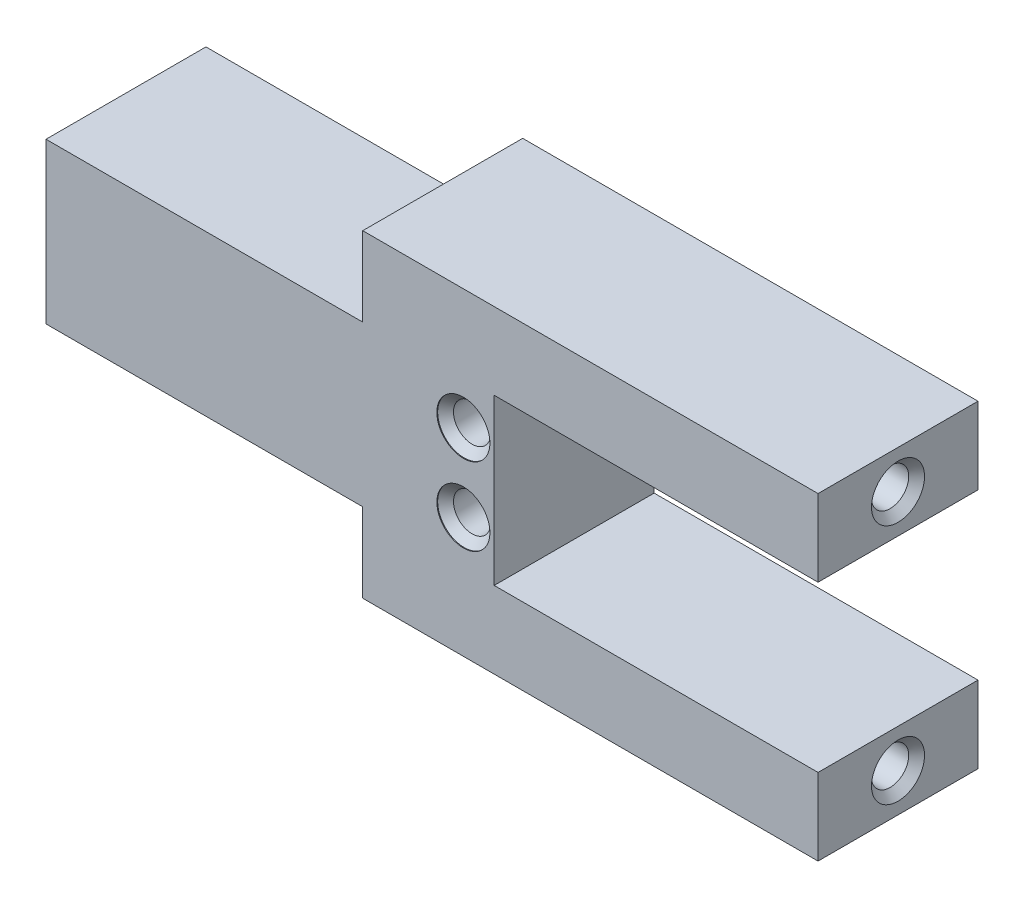
ISO-10303-21;
HEADER;
FILE_DESCRIPTION(('STEP AP214'),'2;1');
FILE_NAME('part.step','',(''),(''),'','','');
FILE_SCHEMA(('AUTOMOTIVE_DESIGN { 1 0 10303 214 1 1 1 1 }'));
ENDSEC;
DATA;
#1=APPLICATION_CONTEXT('core data for automotive mechanical design processes');
#2=APPLICATION_PROTOCOL_DEFINITION('international standard','automotive_design',2000,#1);
#3=PRODUCT_CONTEXT('',#1,'mechanical');
#4=PRODUCT('Part','Part','',(#3));
#5=PRODUCT_RELATED_PRODUCT_CATEGORY('part','',(#4));
#6=PRODUCT_DEFINITION_FORMATION('','',#4);
#7=PRODUCT_DEFINITION_CONTEXT('part definition',#1,'design');
#8=PRODUCT_DEFINITION('design','',#6,#7);
#9=PRODUCT_DEFINITION_SHAPE('','',#8);
#10=(LENGTH_UNIT() NAMED_UNIT(*) SI_UNIT(.MILLI.,.METRE.));
#11=(NAMED_UNIT(*) PLANE_ANGLE_UNIT() SI_UNIT($,.RADIAN.));
#12=(NAMED_UNIT(*) SI_UNIT($,.STERADIAN.) SOLID_ANGLE_UNIT());
#13=UNCERTAINTY_MEASURE_WITH_UNIT(LENGTH_MEASURE(1.E-05),#10,'distance_accuracy_value','');
#14=(GEOMETRIC_REPRESENTATION_CONTEXT(3) GLOBAL_UNCERTAINTY_ASSIGNED_CONTEXT((#13)) GLOBAL_UNIT_ASSIGNED_CONTEXT((#10,
#11,#12)) REPRESENTATION_CONTEXT('',''));
#15=CARTESIAN_POINT('',(0.,0.,0.));
#16=DIRECTION('',(0.,0.,1.));
#17=DIRECTION('',(1.,0.,0.));
#18=AXIS2_PLACEMENT_3D('',#15,#16,#17);
#19=CARTESIAN_POINT('',(84.7,20.1,10.));
#20=DIRECTION('',(0.,-1.,0.));
#21=DIRECTION('',(0.,0.,-1.));
#22=AXIS2_PLACEMENT_3D('',#19,#20,#21);
#23=PLANE('',#22);
#24=DIRECTION('',(0.,0.,-1.));
#25=VECTOR('',#24,1.);
#26=CARTESIAN_POINT('',(15.3,20.1,10.));
#27=LINE('',#26,#25);
#28=CARTESIAN_POINT('',(15.3,20.1,10.1));
#29=VERTEX_POINT('',#28);
#30=CARTESIAN_POINT('',(15.3,20.1,-10.1));
#31=VERTEX_POINT('',#30);
#32=EDGE_CURVE('E260',#29,#31,#27,.T.);
#33=ORIENTED_EDGE('',*,*,#32,.F.);
#34=DIRECTION('',(-1.,0.,0.));
#35=VECTOR('',#34,1.);
#36=CARTESIAN_POINT('',(72.8,20.1,10.1));
#37=LINE('',#36,#35);
#38=CARTESIAN_POINT('',(72.8,20.1,10.1));
#39=VERTEX_POINT('',#38);
#40=EDGE_CURVE('E203',#39,#29,#37,.T.);
#41=ORIENTED_EDGE('',*,*,#40,.F.);
#42=DIRECTION('',(0.,0.,1.));
#43=VECTOR('',#42,1.);
#44=CARTESIAN_POINT('',(72.8,20.1,-10.));
#45=LINE('',#44,#43);
#46=CARTESIAN_POINT('',(72.8,20.1,-10.1));
#47=VERTEX_POINT('',#46);
#48=EDGE_CURVE('E150',#47,#39,#45,.T.);
#49=ORIENTED_EDGE('',*,*,#48,.F.);
#50=DIRECTION('',(1.,0.,0.));
#51=VECTOR('',#50,1.);
#52=CARTESIAN_POINT('',(15.3,20.1,-10.1));
#53=LINE('',#52,#51);
#54=EDGE_CURVE('E174',#31,#47,#53,.T.);
#55=ORIENTED_EDGE('',*,*,#54,.F.);
#56=EDGE_LOOP('',(#33,#41,#49,#55));
#57=FACE_BOUND('',#56,.T.);
#58=ADVANCED_FACE('F41',(#57),#23,.F.);
#59=CARTESIAN_POINT('',(84.7,-20.1,10.));
#60=DIRECTION('',(0.,1.,0.));
#61=DIRECTION('',(0.,0.,1.));
#62=AXIS2_PLACEMENT_3D('',#59,#60,#61);
#63=PLANE('',#62);
#64=DIRECTION('',(0.,0.,1.));
#65=VECTOR('',#64,1.);
#66=CARTESIAN_POINT('',(15.3,-20.1,10.));
#67=LINE('',#66,#65);
#68=CARTESIAN_POINT('',(15.3,-20.1,-10.1));
#69=VERTEX_POINT('',#68);
#70=CARTESIAN_POINT('',(15.3,-20.1,10.1));
#71=VERTEX_POINT('',#70);
#72=EDGE_CURVE('E155',#69,#71,#67,.T.);
#73=ORIENTED_EDGE('',*,*,#72,.F.);
#74=DIRECTION('',(-1.,0.,0.));
#75=VECTOR('',#74,1.);
#76=CARTESIAN_POINT('',(72.8,-20.1,-10.1));
#77=LINE('',#76,#75);
#78=CARTESIAN_POINT('',(72.8,-20.1,-10.1));
#79=VERTEX_POINT('',#78);
#80=EDGE_CURVE('E153',#79,#69,#77,.T.);
#81=ORIENTED_EDGE('',*,*,#80,.F.);
#82=DIRECTION('',(0.,0.,1.));
#83=VECTOR('',#82,1.);
#84=CARTESIAN_POINT('',(72.8,-20.1,-10.));
#85=LINE('',#84,#83);
#86=CARTESIAN_POINT('',(72.8,-20.1,10.1));
#87=VERTEX_POINT('',#86);
#88=EDGE_CURVE('E138',#79,#87,#85,.T.);
#89=ORIENTED_EDGE('',*,*,#88,.T.);
#90=DIRECTION('',(1.,0.,0.));
#91=VECTOR('',#90,1.);
#92=CARTESIAN_POINT('',(15.3,-20.1,10.1));
#93=LINE('',#92,#91);
#94=EDGE_CURVE('E211',#71,#87,#93,.T.);
#95=ORIENTED_EDGE('',*,*,#94,.F.);
#96=EDGE_LOOP('',(#73,#81,#89,#95));
#97=FACE_BOUND('',#96,.T.);
#98=ADVANCED_FACE('F154',(#97),#63,.F.);
#99=CARTESIAN_POINT('',(31.9,10.4,-10.));
#100=DIRECTION('',(-1.,0.,0.));
#101=DIRECTION('',(0.,0.,1.));
#102=AXIS2_PLACEMENT_3D('',#99,#100,#101);
#103=PLANE('',#102);
#104=DIRECTION('',(0.,0.,1.));
#105=VECTOR('',#104,1.);
#106=CARTESIAN_POINT('',(31.9,10.4,-10.));
#107=LINE('',#106,#105);
#108=CARTESIAN_POINT('',(31.9,10.4,-10.1));
#109=VERTEX_POINT('',#108);
#110=CARTESIAN_POINT('',(31.9,10.4,10.1));
#111=VERTEX_POINT('',#110);
#112=EDGE_CURVE('E281',#109,#111,#107,.T.);
#113=ORIENTED_EDGE('',*,*,#112,.T.);
#114=DIRECTION('',(0.,1.,0.));
#115=VECTOR('',#114,1.);
#116=CARTESIAN_POINT('',(31.9,-10.4,10.1));
#117=LINE('',#116,#115);
#118=CARTESIAN_POINT('',(31.9,-10.4,10.1));
#119=VERTEX_POINT('',#118);
#120=EDGE_CURVE('E220',#119,#111,#117,.T.);
#121=ORIENTED_EDGE('',*,*,#120,.F.);
#122=DIRECTION('',(0.,0.,1.));
#123=VECTOR('',#122,1.);
#124=CARTESIAN_POINT('',(31.9,-10.4,-10.));
#125=LINE('',#124,#123);
#126=CARTESIAN_POINT('',(31.9,-10.4,-10.1));
#127=VERTEX_POINT('',#126);
#128=EDGE_CURVE('E149',#127,#119,#125,.T.);
#129=ORIENTED_EDGE('',*,*,#128,.F.);
#130=DIRECTION('',(0.,-1.,0.));
#131=VECTOR('',#130,1.);
#132=CARTESIAN_POINT('',(31.9,10.4,-10.1));
#133=LINE('',#132,#131);
#134=EDGE_CURVE('E186',#109,#127,#133,.T.);
#135=ORIENTED_EDGE('',*,*,#134,.F.);
#136=EDGE_LOOP('',(#113,#121,#129,#135));
#137=FACE_BOUND('',#136,.T.);
#138=ADVANCED_FACE('F372',(#137),#103,.F.);
#139=CARTESIAN_POINT('',(72.8,10.4,-10.));
#140=DIRECTION('',(0.,1.,0.));
#141=DIRECTION('',(-1.,0.,0.));
#142=AXIS2_PLACEMENT_3D('',#139,#140,#141);
#143=PLANE('',#142);
#144=DIRECTION('',(0.,0.,1.));
#145=VECTOR('',#144,1.);
#146=CARTESIAN_POINT('',(72.8,10.4,-10.));
#147=LINE('',#146,#145);
#148=CARTESIAN_POINT('',(72.8,10.4,-10.1));
#149=VERTEX_POINT('',#148);
#150=CARTESIAN_POINT('',(72.8,10.4,10.1));
#151=VERTEX_POINT('',#150);
#152=EDGE_CURVE('E88',#149,#151,#147,.T.);
#153=ORIENTED_EDGE('',*,*,#152,.T.);
#154=DIRECTION('',(1.,0.,0.));
#155=VECTOR('',#154,1.);
#156=CARTESIAN_POINT('',(31.9,10.4,10.1));
#157=LINE('',#156,#155);
#158=EDGE_CURVE('E224',#111,#151,#157,.T.);
#159=ORIENTED_EDGE('',*,*,#158,.F.);
#160=ORIENTED_EDGE('',*,*,#112,.F.);
#161=DIRECTION('',(-1.,0.,0.));
#162=VECTOR('',#161,1.);
#163=CARTESIAN_POINT('',(72.8,10.4,-10.1));
#164=LINE('',#163,#162);
#165=EDGE_CURVE('E182',#149,#109,#164,.T.);
#166=ORIENTED_EDGE('',*,*,#165,.F.);
#167=EDGE_LOOP('',(#153,#159,#160,#166));
#168=FACE_BOUND('',#167,.T.);
#169=ADVANCED_FACE('F524',(#168),#143,.F.);
#170=CARTESIAN_POINT('',(72.8,-10.4,-10.));
#171=DIRECTION('',(0.,-1.,0.));
#172=DIRECTION('',(1.,0.,0.));
#173=AXIS2_PLACEMENT_3D('',#170,#171,#172);
#174=PLANE('',#173);
#175=ORIENTED_EDGE('',*,*,#128,.T.);
#176=DIRECTION('',(-1.,0.,0.));
#177=VECTOR('',#176,1.);
#178=CARTESIAN_POINT('',(72.8,-10.4,10.1));
#179=LINE('',#178,#177);
#180=CARTESIAN_POINT('',(72.8,-10.4,10.1));
#181=VERTEX_POINT('',#180);
#182=EDGE_CURVE('E216',#181,#119,#179,.T.);
#183=ORIENTED_EDGE('',*,*,#182,.F.);
#184=DIRECTION('',(0.,0.,1.));
#185=VECTOR('',#184,1.);
#186=CARTESIAN_POINT('',(72.8,-10.4,-10.));
#187=LINE('',#186,#185);
#188=CARTESIAN_POINT('',(72.8,-10.4,-10.1));
#189=VERTEX_POINT('',#188);
#190=EDGE_CURVE('E287',#189,#181,#187,.T.);
#191=ORIENTED_EDGE('',*,*,#190,.F.);
#192=DIRECTION('',(1.,0.,0.));
#193=VECTOR('',#192,1.);
#194=CARTESIAN_POINT('',(31.9,-10.4,-10.1));
#195=LINE('',#194,#193);
#196=EDGE_CURVE('E167',#127,#189,#195,.T.);
#197=ORIENTED_EDGE('',*,*,#196,.F.);
#198=EDGE_LOOP('',(#175,#183,#191,#197));
#199=FACE_BOUND('',#198,.T.);
#200=ADVANCED_FACE('F363',(#199),#174,.F.);
#201=CARTESIAN_POINT('',(72.8,20.1,-10.));
#202=DIRECTION('',(-1.,0.,0.));
#203=DIRECTION('',(0.,0.,1.));
#204=AXIS2_PLACEMENT_3D('',#201,#202,#203);
#205=PLANE('',#204);
#206=CARTESIAN_POINT('',(72.8,-15.25,0.));
#207=DIRECTION('',(-1.,0.,0.));
#208=DIRECTION('',(0.,0.,1.));
#209=AXIS2_PLACEMENT_3D('',#206,#207,#208);
#210=CIRCLE('',#209,3.35000000000001);
#211=CARTESIAN_POINT('',(72.8,-15.25,3.35));
#212=VERTEX_POINT('',#211);
#213=EDGE_CURVE('E319',#212,#212,#210,.T.);
#214=ORIENTED_EDGE('',*,*,#213,.T.);
#215=EDGE_LOOP('',(#214));
#216=FACE_BOUND('',#215,.T.);
#217=ORIENTED_EDGE('',*,*,#190,.T.);
#218=DIRECTION('',(0.,1.,0.));
#219=VECTOR('',#218,1.);
#220=CARTESIAN_POINT('',(72.8,-20.1,10.1));
#221=LINE('',#220,#219);
#222=EDGE_CURVE('E144',#87,#181,#221,.T.);
#223=ORIENTED_EDGE('',*,*,#222,.F.);
#224=ORIENTED_EDGE('',*,*,#88,.F.);
#225=DIRECTION('',(0.,-1.,0.));
#226=VECTOR('',#225,1.);
#227=CARTESIAN_POINT('',(72.8,-10.4,-10.1));
#228=LINE('',#227,#226);
#229=EDGE_CURVE('E142',#189,#79,#228,.T.);
#230=ORIENTED_EDGE('',*,*,#229,.F.);
#231=EDGE_LOOP('',(#217,#223,#224,#230));
#232=FACE_BOUND('',#231,.T.);
#233=ADVANCED_FACE('F140',(#216,#232),#205,.F.);
#234=CARTESIAN_POINT('',(72.8,15.25,0.));
#235=DIRECTION('',(-1.,0.,0.));
#236=DIRECTION('',(0.,0.,1.));
#237=AXIS2_PLACEMENT_3D('',#234,#235,#236);
#238=CIRCLE('',#237,3.35000000000001);
#239=CARTESIAN_POINT('',(72.8,15.25,3.35000000000001));
#240=VERTEX_POINT('',#239);
#241=EDGE_CURVE('E311',#240,#240,#238,.T.);
#242=ORIENTED_EDGE('',*,*,#241,.T.);
#243=EDGE_LOOP('',(#242));
#244=FACE_BOUND('',#243,.T.);
#245=ORIENTED_EDGE('',*,*,#152,.F.);
#246=DIRECTION('',(0.,-1.,0.));
#247=VECTOR('',#246,1.);
#248=CARTESIAN_POINT('',(72.8,20.1,-10.1));
#249=LINE('',#248,#247);
#250=EDGE_CURVE('E178',#47,#149,#249,.T.);
#251=ORIENTED_EDGE('',*,*,#250,.F.);
#252=ORIENTED_EDGE('',*,*,#48,.T.);
#253=DIRECTION('',(0.,1.,0.));
#254=VECTOR('',#253,1.);
#255=CARTESIAN_POINT('',(72.8,10.4,10.1));
#256=LINE('',#255,#254);
#257=EDGE_CURVE('E199',#151,#39,#256,.T.);
#258=ORIENTED_EDGE('',*,*,#257,.F.);
#259=EDGE_LOOP('',(#245,#251,#252,#258));
#260=FACE_BOUND('',#259,.T.);
#261=ADVANCED_FACE('F351',(#244,#260),#205,.F.);
#262=CARTESIAN_POINT('',(62.8,15.25,0.));
#263=DIRECTION('',(1.,0.,0.));
#264=DIRECTION('',(0.,0.,-1.));
#265=AXIS2_PLACEMENT_3D('',#262,#263,#264);
#266=CYLINDRICAL_SURFACE('',#265,2.35);
#267=CARTESIAN_POINT('',(71.8,15.25,0.));
#268=DIRECTION('',(-1.,0.,0.));
#269=DIRECTION('',(0.,0.,1.));
#270=AXIS2_PLACEMENT_3D('',#267,#268,#269);
#271=CIRCLE('',#270,2.35);
#272=CARTESIAN_POINT('',(71.8,15.25,2.35));
#273=VERTEX_POINT('',#272);
#274=EDGE_CURVE('E307',#273,#273,#271,.F.);
#275=ORIENTED_EDGE('',*,*,#274,.T.);
#276=EDGE_LOOP('',(#275));
#277=FACE_BOUND('',#276,.T.);
#278=CARTESIAN_POINT('',(62.8,15.25,0.));
#279=DIRECTION('',(1.,0.,0.));
#280=DIRECTION('',(0.,0.,1.));
#281=AXIS2_PLACEMENT_3D('',#278,#279,#280);
#282=CIRCLE('',#281,2.35);
#283=CARTESIAN_POINT('',(62.8,15.25,2.35));
#284=VERTEX_POINT('',#283);
#285=EDGE_CURVE('E263',#284,#284,#282,.T.);
#286=ORIENTED_EDGE('',*,*,#285,.F.);
#287=EDGE_LOOP('',(#286));
#288=FACE_BOUND('',#287,.T.);
#289=ADVANCED_FACE('F353',(#277,#288),#266,.F.);
#290=CARTESIAN_POINT('',(62.8,15.25,0.));
#291=DIRECTION('',(-1.,0.,0.));
#292=DIRECTION('',(0.,0.,1.));
#293=AXIS2_PLACEMENT_3D('',#290,#291,#292);
#294=PLANE('',#293);
#295=ORIENTED_EDGE('',*,*,#285,.T.);
#296=EDGE_LOOP('',(#295));
#297=FACE_BOUND('',#296,.T.);
#298=ADVANCED_FACE('F360',(#297),#294,.F.);
#299=CARTESIAN_POINT('',(62.8,-15.25,0.));
#300=DIRECTION('',(1.,0.,0.));
#301=DIRECTION('',(0.,0.,-1.));
#302=AXIS2_PLACEMENT_3D('',#299,#300,#301);
#303=CYLINDRICAL_SURFACE('',#302,2.35);
#304=CARTESIAN_POINT('',(71.8,-15.25,0.));
#305=DIRECTION('',(-1.,0.,0.));
#306=DIRECTION('',(0.,0.,1.));
#307=AXIS2_PLACEMENT_3D('',#304,#305,#306);
#308=CIRCLE('',#307,2.35);
#309=CARTESIAN_POINT('',(71.8,-15.25,2.35));
#310=VERTEX_POINT('',#309);
#311=EDGE_CURVE('E315',#310,#310,#308,.F.);
#312=ORIENTED_EDGE('',*,*,#311,.T.);
#313=EDGE_LOOP('',(#312));
#314=FACE_BOUND('',#313,.T.);
#315=CARTESIAN_POINT('',(62.8,-15.25,0.));
#316=DIRECTION('',(1.,0.,0.));
#317=DIRECTION('',(0.,0.,-1.));
#318=AXIS2_PLACEMENT_3D('',#315,#316,#317);
#319=CIRCLE('',#318,2.35);
#320=CARTESIAN_POINT('',(62.8,-15.25,-2.35));
#321=VERTEX_POINT('',#320);
#322=EDGE_CURVE('E264',#321,#321,#319,.T.);
#323=ORIENTED_EDGE('',*,*,#322,.F.);
#324=EDGE_LOOP('',(#323));
#325=FACE_BOUND('',#324,.T.);
#326=ADVANCED_FACE('F414',(#314,#325),#303,.F.);
#327=CARTESIAN_POINT('',(62.8,-15.25,0.));
#328=DIRECTION('',(1.,0.,0.));
#329=DIRECTION('',(0.,0.,-1.));
#330=AXIS2_PLACEMENT_3D('',#327,#328,#329);
#331=PLANE('',#330);
#332=ORIENTED_EDGE('',*,*,#322,.T.);
#333=EDGE_LOOP('',(#332));
#334=FACE_BOUND('',#333,.T.);
#335=ADVANCED_FACE('F400',(#334),#331,.T.);
#336=CARTESIAN_POINT('',(71.8,15.25,0.));
#337=DIRECTION('',(1.,0.,0.));
#338=DIRECTION('',(0.,0.,-1.));
#339=AXIS2_PLACEMENT_3D('',#336,#337,#338);
#340=CONICAL_SURFACE('',#339,2.35,0.785398163397444);
#341=ORIENTED_EDGE('',*,*,#241,.F.);
#342=EDGE_LOOP('',(#341));
#343=FACE_BOUND('',#342,.T.);
#344=ORIENTED_EDGE('',*,*,#274,.F.);
#345=EDGE_LOOP('',(#344));
#346=FACE_BOUND('',#345,.T.);
#347=ADVANCED_FACE('F394',(#343,#346),#340,.F.);
#348=CARTESIAN_POINT('',(71.8,-15.25,0.));
#349=DIRECTION('',(1.,0.,0.));
#350=DIRECTION('',(0.,0.,-1.));
#351=AXIS2_PLACEMENT_3D('',#348,#349,#350);
#352=CONICAL_SURFACE('',#351,2.35,0.785398163397444);
#353=ORIENTED_EDGE('',*,*,#213,.F.);
#354=EDGE_LOOP('',(#353));
#355=FACE_BOUND('',#354,.T.);
#356=ORIENTED_EDGE('',*,*,#311,.F.);
#357=EDGE_LOOP('',(#356));
#358=FACE_BOUND('',#357,.T.);
#359=ADVANCED_FACE('F399',(#355,#358),#352,.F.);
#360=CARTESIAN_POINT('',(15.3,0.,0.));
#361=DIRECTION('',(1.,0.,0.));
#362=DIRECTION('',(0.,0.,-1.));
#363=AXIS2_PLACEMENT_3D('',#360,#361,#362);
#364=PLANE('',#363);
#365=ORIENTED_EDGE('',*,*,#32,.T.);
#366=DIRECTION('',(0.,1.,0.));
#367=VECTOR('',#366,1.);
#368=CARTESIAN_POINT('',(15.3,-20.1,-10.1));
#369=LINE('',#368,#367);
#370=CARTESIAN_POINT('',(15.3,10.1,-10.1));
#371=VERTEX_POINT('',#370);
#372=EDGE_CURVE('E160',#371,#31,#369,.T.);
#373=ORIENTED_EDGE('',*,*,#372,.F.);
#374=DIRECTION('',(0.,0.,1.));
#375=VECTOR('',#374,1.);
#376=CARTESIAN_POINT('',(15.3,10.1,0.));
#377=LINE('',#376,#375);
#378=CARTESIAN_POINT('',(15.3,10.1,10.1));
#379=VERTEX_POINT('',#378);
#380=EDGE_CURVE('E11',#371,#379,#377,.T.);
#381=ORIENTED_EDGE('',*,*,#380,.T.);
#382=DIRECTION('',(0.,-1.,0.));
#383=VECTOR('',#382,1.);
#384=CARTESIAN_POINT('',(15.3,20.1,10.1));
#385=LINE('',#384,#383);
#386=EDGE_CURVE('E208',#29,#379,#385,.T.);
#387=ORIENTED_EDGE('',*,*,#386,.F.);
#388=EDGE_LOOP('',(#365,#373,#381,#387));
#389=FACE_BOUND('',#388,.T.);
#390=ADVANCED_FACE('F340',(#389),#364,.F.);
#391=CARTESIAN_POINT('',(15.3,0.,0.));
#392=DIRECTION('',(1.,0.,0.));
#393=DIRECTION('',(0.,0.,-1.));
#394=AXIS2_PLACEMENT_3D('',#391,#392,#393);
#395=PLANE('',#394);
#396=ORIENTED_EDGE('',*,*,#72,.T.);
#397=CARTESIAN_POINT('',(15.3,-10.1,10.1));
#398=VERTEX_POINT('',#397);
#399=EDGE_CURVE('E207',#398,#71,#385,.T.);
#400=ORIENTED_EDGE('',*,*,#399,.F.);
#401=DIRECTION('',(0.,0.,-1.));
#402=VECTOR('',#401,1.);
#403=CARTESIAN_POINT('',(15.3,-10.1,0.));
#404=LINE('',#403,#402);
#405=CARTESIAN_POINT('',(15.3,-10.1,-10.1));
#406=VERTEX_POINT('',#405);
#407=EDGE_CURVE('E51',#398,#406,#404,.T.);
#408=ORIENTED_EDGE('',*,*,#407,.T.);
#409=EDGE_CURVE('E171',#69,#406,#369,.T.);
#410=ORIENTED_EDGE('',*,*,#409,.F.);
#411=EDGE_LOOP('',(#396,#400,#408,#410));
#412=FACE_BOUND('',#411,.T.);
#413=ADVANCED_FACE('F328',(#412),#395,.F.);
#414=CARTESIAN_POINT('',(43.8671139599365,-10.1,-10.1));
#415=DIRECTION('',(0.,-1.,0.));
#416=DIRECTION('',(0.,0.,-1.));
#417=AXIS2_PLACEMENT_3D('',#414,#415,#416);
#418=PLANE('',#417);
#419=DIRECTION('',(-1.,0.,0.));
#420=VECTOR('',#419,1.);
#421=CARTESIAN_POINT('',(43.8671139599365,-10.1,-10.1));
#422=LINE('',#421,#420);
#423=CARTESIAN_POINT('',(-24.7,-10.1,-10.1));
#424=VERTEX_POINT('',#423);
#425=EDGE_CURVE('E245',#406,#424,#422,.T.);
#426=ORIENTED_EDGE('',*,*,#425,.F.);
#427=ORIENTED_EDGE('',*,*,#407,.F.);
#428=DIRECTION('',(-1.,0.,0.));
#429=VECTOR('',#428,1.);
#430=CARTESIAN_POINT('',(43.8671139599365,-10.1,10.1));
#431=LINE('',#430,#429);
#432=CARTESIAN_POINT('',(-24.7,-10.1,10.1));
#433=VERTEX_POINT('',#432);
#434=EDGE_CURVE('E76',#398,#433,#431,.T.);
#435=ORIENTED_EDGE('',*,*,#434,.T.);
#436=DIRECTION('',(0.,0.,1.));
#437=VECTOR('',#436,1.);
#438=CARTESIAN_POINT('',(-24.7,-10.1,-10.1));
#439=LINE('',#438,#437);
#440=EDGE_CURVE('E240',#424,#433,#439,.T.);
#441=ORIENTED_EDGE('',*,*,#440,.F.);
#442=EDGE_LOOP('',(#426,#427,#435,#441));
#443=FACE_BOUND('',#442,.T.);
#444=ADVANCED_FACE('F331',(#443),#418,.T.);
#445=CARTESIAN_POINT('',(43.8671139599365,10.1,-10.1));
#446=DIRECTION('',(0.,0.,-1.));
#447=DIRECTION('',(0.,1.,0.));
#448=AXIS2_PLACEMENT_3D('',#445,#446,#447);
#449=PLANE('',#448);
#450=DIRECTION('',(-1.,0.,0.));
#451=VECTOR('',#450,1.);
#452=CARTESIAN_POINT('',(43.8671139599365,10.1,-10.1));
#453=LINE('',#452,#451);
#454=CARTESIAN_POINT('',(-24.7,10.1,-10.1));
#455=VERTEX_POINT('',#454);
#456=EDGE_CURVE('E248',#371,#455,#453,.T.);
#457=ORIENTED_EDGE('',*,*,#456,.F.);
#458=ORIENTED_EDGE('',*,*,#372,.T.);
#459=ORIENTED_EDGE('',*,*,#54,.T.);
#460=ORIENTED_EDGE('',*,*,#250,.T.);
#461=ORIENTED_EDGE('',*,*,#165,.T.);
#462=ORIENTED_EDGE('',*,*,#134,.T.);
#463=ORIENTED_EDGE('',*,*,#196,.T.);
#464=ORIENTED_EDGE('',*,*,#229,.T.);
#465=ORIENTED_EDGE('',*,*,#80,.T.);
#466=ORIENTED_EDGE('',*,*,#409,.T.);
#467=ORIENTED_EDGE('',*,*,#425,.T.);
#468=DIRECTION('',(0.,-1.,0.));
#469=VECTOR('',#468,1.);
#470=CARTESIAN_POINT('',(-24.7,10.1,-10.1));
#471=LINE('',#470,#469);
#472=EDGE_CURVE('E227',#455,#424,#471,.T.);
#473=ORIENTED_EDGE('',*,*,#472,.F.);
#474=EDGE_LOOP('',(#457,#458,#459,#460,#461,#462,#463,#464,#465,#466,#467,#473));
#475=FACE_BOUND('',#474,.T.);
#476=ADVANCED_FACE('F164',(#475),#449,.T.);
#477=CARTESIAN_POINT('',(43.8671139599365,10.1,10.1));
#478=DIRECTION('',(0.,1.,0.));
#479=DIRECTION('',(0.,0.,1.));
#480=AXIS2_PLACEMENT_3D('',#477,#478,#479);
#481=PLANE('',#480);
#482=DIRECTION('',(-1.,0.,0.));
#483=VECTOR('',#482,1.);
#484=CARTESIAN_POINT('',(43.8671139599365,10.1,10.1));
#485=LINE('',#484,#483);
#486=CARTESIAN_POINT('',(-24.7,10.1,10.1));
#487=VERTEX_POINT('',#486);
#488=EDGE_CURVE('E244',#379,#487,#485,.T.);
#489=ORIENTED_EDGE('',*,*,#488,.F.);
#490=ORIENTED_EDGE('',*,*,#380,.F.);
#491=ORIENTED_EDGE('',*,*,#456,.T.);
#492=DIRECTION('',(0.,0.,-1.));
#493=VECTOR('',#492,1.);
#494=CARTESIAN_POINT('',(-24.7,10.1,10.1));
#495=LINE('',#494,#493);
#496=EDGE_CURVE('E232',#487,#455,#495,.T.);
#497=ORIENTED_EDGE('',*,*,#496,.F.);
#498=EDGE_LOOP('',(#489,#490,#491,#497));
#499=FACE_BOUND('',#498,.T.);
#500=ADVANCED_FACE('F339',(#499),#481,.T.);
#501=CARTESIAN_POINT('',(43.8671139599365,-10.1,10.1));
#502=DIRECTION('',(0.,0.,1.));
#503=DIRECTION('',(0.,-1.,0.));
#504=AXIS2_PLACEMENT_3D('',#501,#502,#503);
#505=PLANE('',#504);
#506=ORIENTED_EDGE('',*,*,#434,.F.);
#507=ORIENTED_EDGE('',*,*,#399,.T.);
#508=ORIENTED_EDGE('',*,*,#94,.T.);
#509=ORIENTED_EDGE('',*,*,#222,.T.);
#510=ORIENTED_EDGE('',*,*,#182,.T.);
#511=ORIENTED_EDGE('',*,*,#120,.T.);
#512=ORIENTED_EDGE('',*,*,#158,.T.);
#513=ORIENTED_EDGE('',*,*,#257,.T.);
#514=ORIENTED_EDGE('',*,*,#40,.T.);
#515=ORIENTED_EDGE('',*,*,#386,.T.);
#516=ORIENTED_EDGE('',*,*,#488,.T.);
#517=DIRECTION('',(0.,1.,0.));
#518=VECTOR('',#517,1.);
#519=CARTESIAN_POINT('',(-24.7,-10.1,10.1));
#520=LINE('',#519,#518);
#521=EDGE_CURVE('E236',#433,#487,#520,.T.);
#522=ORIENTED_EDGE('',*,*,#521,.F.);
#523=EDGE_LOOP('',(#506,#507,#508,#509,#510,#511,#512,#513,#514,#515,#516,#522));
#524=FACE_BOUND('',#523,.T.);
#525=CARTESIAN_POINT('',(28.01,-4.9,10.1));
#526=DIRECTION('',(0.,0.,1.));
#527=DIRECTION('',(1.,0.,0.));
#528=AXIS2_PLACEMENT_3D('',#525,#526,#527);
#529=CIRCLE('',#528,3.34999999999999);
#530=CARTESIAN_POINT('',(31.36,-4.9,10.1));
#531=VERTEX_POINT('',#530);
#532=EDGE_CURVE('E195',#531,#531,#529,.T.);
#533=ORIENTED_EDGE('',*,*,#532,.F.);
#534=EDGE_LOOP('',(#533));
#535=FACE_BOUND('',#534,.T.);
#536=CARTESIAN_POINT('',(28.01,4.9,10.1));
#537=DIRECTION('',(0.,0.,1.));
#538=DIRECTION('',(1.,0.,0.));
#539=AXIS2_PLACEMENT_3D('',#536,#537,#538);
#540=CIRCLE('',#539,3.34999999999999);
#541=CARTESIAN_POINT('',(31.36,4.9,10.1));
#542=VERTEX_POINT('',#541);
#543=EDGE_CURVE('E191',#542,#542,#540,.T.);
#544=ORIENTED_EDGE('',*,*,#543,.F.);
#545=EDGE_LOOP('',(#544));
#546=FACE_BOUND('',#545,.T.);
#547=ADVANCED_FACE('F344',(#524,#535,#546),#505,.T.);
#548=CARTESIAN_POINT('',(-22.7,0.,0.));
#549=DIRECTION('',(-1.,0.,0.));
#550=DIRECTION('',(0.,0.,1.));
#551=AXIS2_PLACEMENT_3D('',#548,#549,#550);
#552=PLANE('',#551);
#553=CARTESIAN_POINT('',(-22.7,0.,0.));
#554=DIRECTION('',(-1.,0.,0.));
#555=DIRECTION('',(0.,0.,1.));
#556=AXIS2_PLACEMENT_3D('',#553,#554,#555);
#557=CIRCLE('',#556,0.0133630953863843);
#558=CARTESIAN_POINT('',(-22.7,0.,0.0133630953863843));
#559=VERTEX_POINT('',#558);
#560=EDGE_CURVE('E323',#559,#559,#557,.T.);
#561=ORIENTED_EDGE('',*,*,#560,.T.);
#562=EDGE_LOOP('',(#561));
#563=FACE_BOUND('',#562,.T.);
#564=ADVANCED_FACE('F577',(#563),#552,.T.);
#565=CARTESIAN_POINT('',(-25.93,0.,0.));
#566=DIRECTION('',(1.,0.,0.));
#567=DIRECTION('',(0.,0.,-1.));
#568=AXIS2_PLACEMENT_3D('',#565,#566,#567);
#569=DEGENERATE_TOROIDAL_SURFACE('',#568,0.0133630953863843,3.23,.T.);
#570=CARTESIAN_POINT('',(-24.7,0.,0.));
#571=DIRECTION('',(-1.,0.,0.));
#572=DIRECTION('',(0.,0.,1.));
#573=AXIS2_PLACEMENT_3D('',#570,#571,#572);
#574=CIRCLE('',#573,3.);
#575=CARTESIAN_POINT('',(-24.7,0.,3.));
#576=VERTEX_POINT('',#575);
#577=EDGE_CURVE('E231',#576,#576,#574,.T.);
#578=ORIENTED_EDGE('',*,*,#577,.T.);
#579=EDGE_LOOP('',(#578));
#580=FACE_BOUND('',#579,.T.);
#581=ORIENTED_EDGE('',*,*,#560,.F.);
#582=EDGE_LOOP('',(#581));
#583=FACE_BOUND('',#582,.T.);
#584=ADVANCED_FACE('F43',(#580,#583),#569,.F.);
#585=CARTESIAN_POINT('',(-24.7,0.,0.));
#586=DIRECTION('',(1.,0.,0.));
#587=DIRECTION('',(0.,0.,-1.));
#588=AXIS2_PLACEMENT_3D('',#585,#586,#587);
#589=PLANE('',#588);
#590=ORIENTED_EDGE('',*,*,#577,.F.);
#591=EDGE_LOOP('',(#590));
#592=FACE_BOUND('',#591,.T.);
#593=ORIENTED_EDGE('',*,*,#440,.T.);
#594=ORIENTED_EDGE('',*,*,#521,.T.);
#595=ORIENTED_EDGE('',*,*,#496,.T.);
#596=ORIENTED_EDGE('',*,*,#472,.T.);
#597=EDGE_LOOP('',(#593,#594,#595,#596));
#598=FACE_BOUND('',#597,.T.);
#599=ADVANCED_FACE('F333',(#592,#598),#589,.F.);
#600=CARTESIAN_POINT('',(28.01,-4.9,10.1));
#601=DIRECTION('',(0.,0.,-1.));
#602=DIRECTION('',(-1.,0.,0.));
#603=AXIS2_PLACEMENT_3D('',#600,#601,#602);
#604=CYLINDRICAL_SURFACE('',#603,3.34999999999999);
#605=ORIENTED_EDGE('',*,*,#532,.T.);
#606=EDGE_LOOP('',(#605));
#607=FACE_BOUND('',#606,.T.);
#608=CARTESIAN_POINT('',(28.01,-4.9,10.));
#609=DIRECTION('',(0.,0.,-1.));
#610=DIRECTION('',(-1.,0.,0.));
#611=AXIS2_PLACEMENT_3D('',#608,#609,#610);
#612=CIRCLE('',#611,3.34999999999999);
#613=CARTESIAN_POINT('',(24.66,-4.9,10.));
#614=VERTEX_POINT('',#613);
#615=EDGE_CURVE('E295',#614,#614,#612,.T.);
#616=ORIENTED_EDGE('',*,*,#615,.T.);
#617=EDGE_LOOP('',(#616));
#618=FACE_BOUND('',#617,.T.);
#619=ADVANCED_FACE('F601',(#607,#618),#604,.F.);
#620=CARTESIAN_POINT('',(28.01,4.9,10.1));
#621=DIRECTION('',(0.,0.,-1.));
#622=DIRECTION('',(-1.,0.,0.));
#623=AXIS2_PLACEMENT_3D('',#620,#621,#622);
#624=CYLINDRICAL_SURFACE('',#623,3.34999999999999);
#625=ORIENTED_EDGE('',*,*,#543,.T.);
#626=EDGE_LOOP('',(#625));
#627=FACE_BOUND('',#626,.T.);
#628=CARTESIAN_POINT('',(28.01,4.9,10.));
#629=DIRECTION('',(0.,0.,-1.));
#630=DIRECTION('',(-1.,0.,0.));
#631=AXIS2_PLACEMENT_3D('',#628,#629,#630);
#632=CIRCLE('',#631,3.34999999999999);
#633=CARTESIAN_POINT('',(24.66,4.9,10.));
#634=VERTEX_POINT('',#633);
#635=EDGE_CURVE('E299',#634,#634,#632,.T.);
#636=ORIENTED_EDGE('',*,*,#635,.T.);
#637=EDGE_LOOP('',(#636));
#638=FACE_BOUND('',#637,.T.);
#639=ADVANCED_FACE('F437',(#627,#638),#624,.F.);
#640=CARTESIAN_POINT('',(28.01,-4.9,0.));
#641=DIRECTION('',(0.,0.,-1.));
#642=DIRECTION('',(-1.,0.,0.));
#643=AXIS2_PLACEMENT_3D('',#640,#641,#642);
#644=PLANE('',#643);
#645=CARTESIAN_POINT('',(28.01,-4.9,0.));
#646=DIRECTION('',(0.,0.,1.));
#647=DIRECTION('',(-1.,0.,0.));
#648=AXIS2_PLACEMENT_3D('',#645,#646,#647);
#649=CIRCLE('',#648,2.35);
#650=CARTESIAN_POINT('',(25.66,-4.9,0.));
#651=VERTEX_POINT('',#650);
#652=EDGE_CURVE('E268',#651,#651,#649,.T.);
#653=ORIENTED_EDGE('',*,*,#652,.T.);
#654=EDGE_LOOP('',(#653));
#655=FACE_BOUND('',#654,.T.);
#656=ADVANCED_FACE('F435',(#655),#644,.F.);
#657=CARTESIAN_POINT('',(28.01,-4.9,0.));
#658=DIRECTION('',(0.,0.,1.));
#659=DIRECTION('',(1.,0.,0.));
#660=AXIS2_PLACEMENT_3D('',#657,#658,#659);
#661=CYLINDRICAL_SURFACE('',#660,2.35);
#662=CARTESIAN_POINT('',(28.01,-4.9,9.00000000000002));
#663=DIRECTION('',(0.,0.,-1.));
#664=DIRECTION('',(-1.,0.,0.));
#665=AXIS2_PLACEMENT_3D('',#662,#663,#664);
#666=CIRCLE('',#665,2.35);
#667=CARTESIAN_POINT('',(25.66,-4.9,9.00000000000002));
#668=VERTEX_POINT('',#667);
#669=EDGE_CURVE('E303',#668,#668,#666,.F.);
#670=ORIENTED_EDGE('',*,*,#669,.T.);
#671=EDGE_LOOP('',(#670));
#672=FACE_BOUND('',#671,.T.);
#673=ORIENTED_EDGE('',*,*,#652,.F.);
#674=EDGE_LOOP('',(#673));
#675=FACE_BOUND('',#674,.T.);
#676=ADVANCED_FACE('F392',(#672,#675),#661,.F.);
#677=CARTESIAN_POINT('',(28.01,-4.9,9.00000000000002));
#678=DIRECTION('',(0.,0.,1.));
#679=DIRECTION('',(1.,0.,0.));
#680=AXIS2_PLACEMENT_3D('',#677,#678,#679);
#681=CONICAL_SURFACE('',#680,2.35,0.78539816339745);
#682=ORIENTED_EDGE('',*,*,#615,.F.);
#683=EDGE_LOOP('',(#682));
#684=FACE_BOUND('',#683,.T.);
#685=ORIENTED_EDGE('',*,*,#669,.F.);
#686=EDGE_LOOP('',(#685));
#687=FACE_BOUND('',#686,.T.);
#688=ADVANCED_FACE('F385',(#684,#687),#681,.F.);
#689=CARTESIAN_POINT('',(28.01,4.9,0.));
#690=DIRECTION('',(0.,0.,1.));
#691=DIRECTION('',(1.,0.,0.));
#692=AXIS2_PLACEMENT_3D('',#689,#690,#691);
#693=PLANE('',#692);
#694=CARTESIAN_POINT('',(28.01,4.9,0.));
#695=DIRECTION('',(0.,0.,1.));
#696=DIRECTION('',(1.,0.,0.));
#697=AXIS2_PLACEMENT_3D('',#694,#695,#696);
#698=CIRCLE('',#697,2.35);
#699=CARTESIAN_POINT('',(30.36,4.9,0.));
#700=VERTEX_POINT('',#699);
#701=EDGE_CURVE('E272',#700,#700,#698,.T.);
#702=ORIENTED_EDGE('',*,*,#701,.T.);
#703=EDGE_LOOP('',(#702));
#704=FACE_BOUND('',#703,.T.);
#705=ADVANCED_FACE('F391',(#704),#693,.T.);
#706=CARTESIAN_POINT('',(28.01,4.9,0.));
#707=DIRECTION('',(0.,0.,1.));
#708=DIRECTION('',(1.,0.,0.));
#709=AXIS2_PLACEMENT_3D('',#706,#707,#708);
#710=CYLINDRICAL_SURFACE('',#709,2.35);
#711=CARTESIAN_POINT('',(28.01,4.9,9.00000000000002));
#712=DIRECTION('',(0.,0.,-1.));
#713=DIRECTION('',(-1.,0.,0.));
#714=AXIS2_PLACEMENT_3D('',#711,#712,#713);
#715=CIRCLE('',#714,2.35);
#716=CARTESIAN_POINT('',(25.66,4.9,9.00000000000002));
#717=VERTEX_POINT('',#716);
#718=EDGE_CURVE('E284',#717,#717,#715,.F.);
#719=ORIENTED_EDGE('',*,*,#718,.T.);
#720=EDGE_LOOP('',(#719));
#721=FACE_BOUND('',#720,.T.);
#722=ORIENTED_EDGE('',*,*,#701,.F.);
#723=EDGE_LOOP('',(#722));
#724=FACE_BOUND('',#723,.T.);
#725=ADVANCED_FACE('F383',(#721,#724),#710,.F.);
#726=CARTESIAN_POINT('',(28.01,4.9,9.00000000000002));
#727=DIRECTION('',(0.,0.,1.));
#728=DIRECTION('',(1.,0.,0.));
#729=AXIS2_PLACEMENT_3D('',#726,#727,#728);
#730=CONICAL_SURFACE('',#729,2.35,0.785398163397451);
#731=ORIENTED_EDGE('',*,*,#635,.F.);
#732=EDGE_LOOP('',(#731));
#733=FACE_BOUND('',#732,.T.);
#734=ORIENTED_EDGE('',*,*,#718,.F.);
#735=EDGE_LOOP('',(#734));
#736=FACE_BOUND('',#735,.T.);
#737=ADVANCED_FACE('F377',(#733,#736),#730,.F.);
#738=CLOSED_SHELL('',(#58,#98,#138,#169,#200,#233,#261,#289,#298,#326,#335,#347,#359,#390,#413,
#444,#476,#500,#547,#564,#584,#599,#619,#639,#656,#676,#688,#705,#725,#737));
#739=MANIFOLD_SOLID_BREP('B2',#738);
#740=ADVANCED_BREP_SHAPE_REPRESENTATION('',(#18,#739),#14);
#741=SHAPE_DEFINITION_REPRESENTATION(#9,#740);
ENDSEC;
END-ISO-10303-21;
